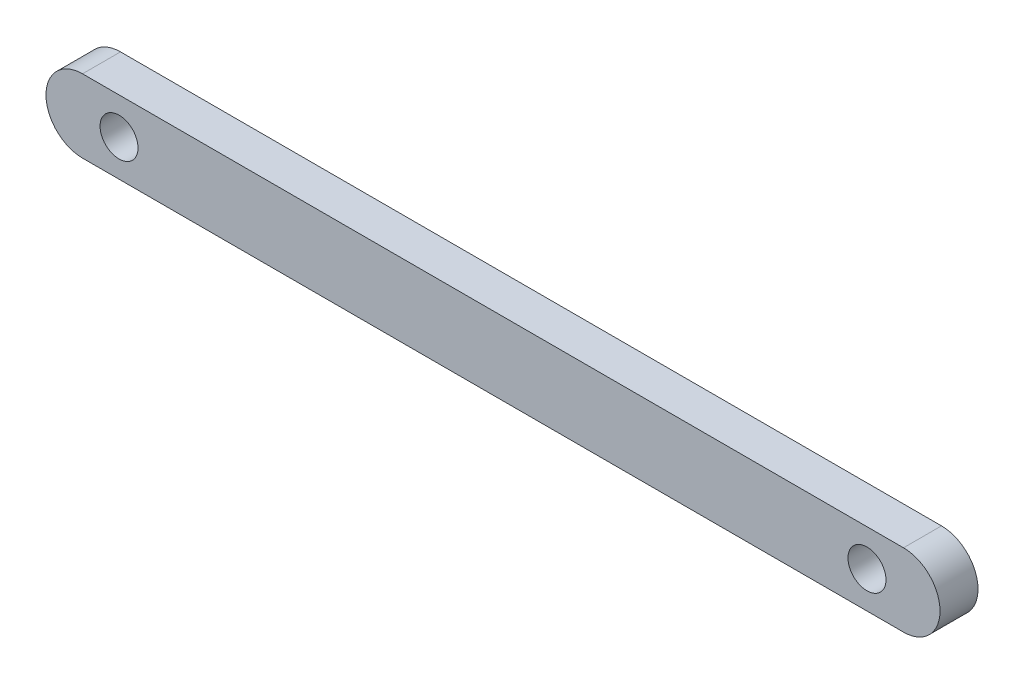
ISO-10303-21;
HEADER;
FILE_DESCRIPTION(('STEP AP214'),'2;1');
FILE_NAME('part.step','',(''),(''),'','','');
FILE_SCHEMA(('AUTOMOTIVE_DESIGN { 1 0 10303 214 1 1 1 1 }'));
ENDSEC;
DATA;
#1=APPLICATION_CONTEXT('core data for automotive mechanical design processes');
#2=APPLICATION_PROTOCOL_DEFINITION('international standard','automotive_design',2000,#1);
#3=PRODUCT_CONTEXT('',#1,'mechanical');
#4=PRODUCT('Part','Part','',(#3));
#5=PRODUCT_RELATED_PRODUCT_CATEGORY('part','',(#4));
#6=PRODUCT_DEFINITION_FORMATION('','',#4);
#7=PRODUCT_DEFINITION_CONTEXT('part definition',#1,'design');
#8=PRODUCT_DEFINITION('design','',#6,#7);
#9=PRODUCT_DEFINITION_SHAPE('','',#8);
#10=(LENGTH_UNIT() NAMED_UNIT(*) SI_UNIT(.MILLI.,.METRE.));
#11=(NAMED_UNIT(*) PLANE_ANGLE_UNIT() SI_UNIT($,.RADIAN.));
#12=(NAMED_UNIT(*) SI_UNIT($,.STERADIAN.) SOLID_ANGLE_UNIT());
#13=UNCERTAINTY_MEASURE_WITH_UNIT(LENGTH_MEASURE(1.E-05),#10,'distance_accuracy_value','');
#14=(GEOMETRIC_REPRESENTATION_CONTEXT(3) GLOBAL_UNCERTAINTY_ASSIGNED_CONTEXT((#13)) GLOBAL_UNIT_ASSIGNED_CONTEXT((#10,
#11,#12)) REPRESENTATION_CONTEXT('',''));
#15=CARTESIAN_POINT('',(0.,0.,0.));
#16=DIRECTION('',(0.,0.,1.));
#17=DIRECTION('',(1.,0.,0.));
#18=AXIS2_PLACEMENT_3D('',#15,#16,#17);
#19=CARTESIAN_POINT('',(-35.687,0.,3.302));
#20=DIRECTION('',(0.,0.,-1.));
#21=DIRECTION('',(-1.,0.,0.));
#22=AXIS2_PLACEMENT_3D('',#19,#20,#21);
#23=CYLINDRICAL_SURFACE('',#22,3.17500000000001);
#24=CARTESIAN_POINT('',(-35.687,0.,0.));
#25=DIRECTION('',(0.,0.,1.));
#26=DIRECTION('',(1.,0.,0.));
#27=AXIS2_PLACEMENT_3D('',#24,#25,#26);
#28=CIRCLE('',#27,3.17500000000001);
#29=CARTESIAN_POINT('',(-35.687,3.17500000000001,0.));
#30=VERTEX_POINT('',#29);
#31=CARTESIAN_POINT('',(-35.687,-3.17500000000001,0.));
#32=VERTEX_POINT('',#31);
#33=EDGE_CURVE('E98',#30,#32,#28,.T.);
#34=ORIENTED_EDGE('',*,*,#33,.T.);
#35=DIRECTION('',(0.,0.,-1.));
#36=VECTOR('',#35,1.);
#37=CARTESIAN_POINT('',(-35.687,-3.17500000000001,3.302));
#38=LINE('',#37,#36);
#39=CARTESIAN_POINT('',(-35.687,-3.17500000000001,3.302));
#40=VERTEX_POINT('',#39);
#41=EDGE_CURVE('E11',#40,#32,#38,.T.);
#42=ORIENTED_EDGE('',*,*,#41,.F.);
#43=CARTESIAN_POINT('',(-35.687,0.,3.302));
#44=DIRECTION('',(0.,0.,1.));
#45=DIRECTION('',(1.,0.,0.));
#46=AXIS2_PLACEMENT_3D('',#43,#44,#45);
#47=CIRCLE('',#46,3.17500000000001);
#48=CARTESIAN_POINT('',(-35.687,3.17500000000001,3.302));
#49=VERTEX_POINT('',#48);
#50=EDGE_CURVE('E86',#49,#40,#47,.T.);
#51=ORIENTED_EDGE('',*,*,#50,.F.);
#52=DIRECTION('',(0.,0.,-1.));
#53=VECTOR('',#52,1.);
#54=CARTESIAN_POINT('',(-35.687,3.17500000000001,3.302));
#55=LINE('',#54,#53);
#56=EDGE_CURVE('E94',#49,#30,#55,.T.);
#57=ORIENTED_EDGE('',*,*,#56,.T.);
#58=EDGE_LOOP('',(#34,#42,#51,#57));
#59=FACE_BOUND('',#58,.T.);
#60=ADVANCED_FACE('F35',(#59),#23,.T.);
#61=CARTESIAN_POINT('',(-35.687,-3.17500000000001,3.302));
#62=DIRECTION('',(0.,1.,0.));
#63=DIRECTION('',(0.,0.,1.));
#64=AXIS2_PLACEMENT_3D('',#61,#62,#63);
#65=PLANE('',#64);
#66=DIRECTION('',(1.,0.,0.));
#67=VECTOR('',#66,1.);
#68=CARTESIAN_POINT('',(-35.687,-3.17500000000001,0.));
#69=LINE('',#68,#67);
#70=CARTESIAN_POINT('',(35.687,-3.175,0.));
#71=VERTEX_POINT('',#70);
#72=EDGE_CURVE('E90',#32,#71,#69,.T.);
#73=ORIENTED_EDGE('',*,*,#72,.T.);
#74=DIRECTION('',(0.,0.,-1.));
#75=VECTOR('',#74,1.);
#76=CARTESIAN_POINT('',(35.687,-3.175,3.302));
#77=LINE('',#76,#75);
#78=CARTESIAN_POINT('',(35.687,-3.175,3.302));
#79=VERTEX_POINT('',#78);
#80=EDGE_CURVE('E43',#79,#71,#77,.T.);
#81=ORIENTED_EDGE('',*,*,#80,.F.);
#82=DIRECTION('',(1.,0.,0.));
#83=VECTOR('',#82,1.);
#84=CARTESIAN_POINT('',(-35.687,-3.17500000000001,3.302));
#85=LINE('',#84,#83);
#86=EDGE_CURVE('E81',#40,#79,#85,.T.);
#87=ORIENTED_EDGE('',*,*,#86,.F.);
#88=ORIENTED_EDGE('',*,*,#41,.T.);
#89=EDGE_LOOP('',(#73,#81,#87,#88));
#90=FACE_BOUND('',#89,.T.);
#91=ADVANCED_FACE('F89',(#90),#65,.F.);
#92=CARTESIAN_POINT('',(35.687,0.,3.302));
#93=DIRECTION('',(0.,0.,-1.));
#94=DIRECTION('',(-1.,0.,0.));
#95=AXIS2_PLACEMENT_3D('',#92,#93,#94);
#96=CYLINDRICAL_SURFACE('',#95,3.17500000000001);
#97=CARTESIAN_POINT('',(35.687,0.,0.));
#98=DIRECTION('',(0.,0.,1.));
#99=DIRECTION('',(1.,0.,0.));
#100=AXIS2_PLACEMENT_3D('',#97,#98,#99);
#101=CIRCLE('',#100,3.17500000000001);
#102=CARTESIAN_POINT('',(35.687,3.17500000000001,0.));
#103=VERTEX_POINT('',#102);
#104=EDGE_CURVE('E68',#71,#103,#101,.T.);
#105=ORIENTED_EDGE('',*,*,#104,.T.);
#106=DIRECTION('',(0.,0.,-1.));
#107=VECTOR('',#106,1.);
#108=CARTESIAN_POINT('',(35.687,3.17500000000001,3.302));
#109=LINE('',#108,#107);
#110=CARTESIAN_POINT('',(35.687,3.17500000000001,3.302));
#111=VERTEX_POINT('',#110);
#112=EDGE_CURVE('E91',#111,#103,#109,.T.);
#113=ORIENTED_EDGE('',*,*,#112,.F.);
#114=CARTESIAN_POINT('',(35.687,0.,3.302));
#115=DIRECTION('',(0.,0.,1.));
#116=DIRECTION('',(1.,0.,0.));
#117=AXIS2_PLACEMENT_3D('',#114,#115,#116);
#118=CIRCLE('',#117,3.17500000000001);
#119=EDGE_CURVE('E84',#79,#111,#118,.T.);
#120=ORIENTED_EDGE('',*,*,#119,.F.);
#121=ORIENTED_EDGE('',*,*,#80,.T.);
#122=EDGE_LOOP('',(#105,#113,#120,#121));
#123=FACE_BOUND('',#122,.T.);
#124=ADVANCED_FACE('F92',(#123),#96,.T.);
#125=CARTESIAN_POINT('',(-35.687,3.17500000000001,3.302));
#126=DIRECTION('',(0.,-1.,0.));
#127=DIRECTION('',(0.,0.,-1.));
#128=AXIS2_PLACEMENT_3D('',#125,#126,#127);
#129=PLANE('',#128);
#130=DIRECTION('',(-1.,0.,0.));
#131=VECTOR('',#130,1.);
#132=CARTESIAN_POINT('',(-35.687,3.17500000000001,0.));
#133=LINE('',#132,#131);
#134=EDGE_CURVE('E74',#103,#30,#133,.T.);
#135=ORIENTED_EDGE('',*,*,#134,.T.);
#136=ORIENTED_EDGE('',*,*,#56,.F.);
#137=DIRECTION('',(-1.,0.,0.));
#138=VECTOR('',#137,1.);
#139=CARTESIAN_POINT('',(-35.687,3.17500000000001,3.302));
#140=LINE('',#139,#138);
#141=EDGE_CURVE('E51',#111,#49,#140,.T.);
#142=ORIENTED_EDGE('',*,*,#141,.F.);
#143=ORIENTED_EDGE('',*,*,#112,.T.);
#144=EDGE_LOOP('',(#135,#136,#142,#143));
#145=FACE_BOUND('',#144,.T.);
#146=ADVANCED_FACE('F106',(#145),#129,.F.);
#147=CARTESIAN_POINT('',(-35.687,0.,3.302));
#148=DIRECTION('',(0.,0.,1.));
#149=DIRECTION('',(1.,0.,0.));
#150=AXIS2_PLACEMENT_3D('',#147,#148,#149);
#151=PLANE('',#150);
#152=CARTESIAN_POINT('',(-32.512,0.,3.302));
#153=DIRECTION('',(0.,0.,1.));
#154=DIRECTION('',(1.,0.,0.));
#155=AXIS2_PLACEMENT_3D('',#152,#153,#154);
#156=CIRCLE('',#155,1.65099999999999);
#157=CARTESIAN_POINT('',(-30.861,0.,3.302));
#158=VERTEX_POINT('',#157);
#159=EDGE_CURVE('E120',#158,#158,#156,.T.);
#160=ORIENTED_EDGE('',*,*,#159,.F.);
#161=EDGE_LOOP('',(#160));
#162=FACE_BOUND('',#161,.T.);
#163=CARTESIAN_POINT('',(32.512,0.,3.302));
#164=DIRECTION('',(0.,0.,1.));
#165=DIRECTION('',(1.,0.,0.));
#166=AXIS2_PLACEMENT_3D('',#163,#164,#165);
#167=CIRCLE('',#166,1.65099999999999);
#168=CARTESIAN_POINT('',(34.163,0.,3.302));
#169=VERTEX_POINT('',#168);
#170=EDGE_CURVE('E114',#169,#169,#167,.T.);
#171=ORIENTED_EDGE('',*,*,#170,.F.);
#172=EDGE_LOOP('',(#171));
#173=FACE_BOUND('',#172,.T.);
#174=ORIENTED_EDGE('',*,*,#50,.T.);
#175=ORIENTED_EDGE('',*,*,#86,.T.);
#176=ORIENTED_EDGE('',*,*,#119,.T.);
#177=ORIENTED_EDGE('',*,*,#141,.T.);
#178=EDGE_LOOP('',(#174,#175,#176,#177));
#179=FACE_BOUND('',#178,.T.);
#180=ADVANCED_FACE('F82',(#162,#173,#179),#151,.T.);
#181=CARTESIAN_POINT('',(-35.687,0.,0.));
#182=DIRECTION('',(0.,0.,1.));
#183=DIRECTION('',(1.,0.,0.));
#184=AXIS2_PLACEMENT_3D('',#181,#182,#183);
#185=PLANE('',#184);
#186=CARTESIAN_POINT('',(-32.512,0.,0.));
#187=DIRECTION('',(0.,0.,1.));
#188=DIRECTION('',(1.,0.,0.));
#189=AXIS2_PLACEMENT_3D('',#186,#187,#188);
#190=CIRCLE('',#189,1.651);
#191=CARTESIAN_POINT('',(-30.861,0.,0.));
#192=VERTEX_POINT('',#191);
#193=EDGE_CURVE('E117',#192,#192,#190,.T.);
#194=ORIENTED_EDGE('',*,*,#193,.T.);
#195=EDGE_LOOP('',(#194));
#196=FACE_BOUND('',#195,.T.);
#197=CARTESIAN_POINT('',(32.512,0.,0.));
#198=DIRECTION('',(0.,0.,1.));
#199=DIRECTION('',(1.,0.,0.));
#200=AXIS2_PLACEMENT_3D('',#197,#198,#199);
#201=CIRCLE('',#200,1.651);
#202=CARTESIAN_POINT('',(34.163,0.,0.));
#203=VERTEX_POINT('',#202);
#204=EDGE_CURVE('E101',#203,#203,#201,.T.);
#205=ORIENTED_EDGE('',*,*,#204,.T.);
#206=EDGE_LOOP('',(#205));
#207=FACE_BOUND('',#206,.T.);
#208=ORIENTED_EDGE('',*,*,#33,.F.);
#209=ORIENTED_EDGE('',*,*,#134,.F.);
#210=ORIENTED_EDGE('',*,*,#104,.F.);
#211=ORIENTED_EDGE('',*,*,#72,.F.);
#212=EDGE_LOOP('',(#208,#209,#210,#211));
#213=FACE_BOUND('',#212,.T.);
#214=ADVANCED_FACE('F109',(#196,#207,#213),#185,.F.);
#215=CARTESIAN_POINT('',(32.512,0.,3.302));
#216=DIRECTION('',(0.,0.,1.));
#217=DIRECTION('',(1.,0.,0.));
#218=AXIS2_PLACEMENT_3D('',#215,#216,#217);
#219=CYLINDRICAL_SURFACE('',#218,1.65099999999999);
#220=ORIENTED_EDGE('',*,*,#204,.F.);
#221=EDGE_LOOP('',(#220));
#222=FACE_BOUND('',#221,.T.);
#223=ORIENTED_EDGE('',*,*,#170,.T.);
#224=EDGE_LOOP('',(#223));
#225=FACE_BOUND('',#224,.T.);
#226=ADVANCED_FACE('F131',(#222,#225),#219,.F.);
#227=CARTESIAN_POINT('',(-32.512,0.,3.302));
#228=DIRECTION('',(0.,0.,1.));
#229=DIRECTION('',(1.,0.,0.));
#230=AXIS2_PLACEMENT_3D('',#227,#228,#229);
#231=CYLINDRICAL_SURFACE('',#230,1.65099999999999);
#232=ORIENTED_EDGE('',*,*,#193,.F.);
#233=EDGE_LOOP('',(#232));
#234=FACE_BOUND('',#233,.T.);
#235=ORIENTED_EDGE('',*,*,#159,.T.);
#236=EDGE_LOOP('',(#235));
#237=FACE_BOUND('',#236,.T.);
#238=ADVANCED_FACE('F124',(#234,#237),#231,.F.);
#239=CLOSED_SHELL('',(#60,#91,#124,#146,#180,#214,#226,#238));
#240=MANIFOLD_SOLID_BREP('B2',#239);
#241=ADVANCED_BREP_SHAPE_REPRESENTATION('',(#18,#240),#14);
#242=SHAPE_DEFINITION_REPRESENTATION(#9,#241);
ENDSEC;
END-ISO-10303-21;
